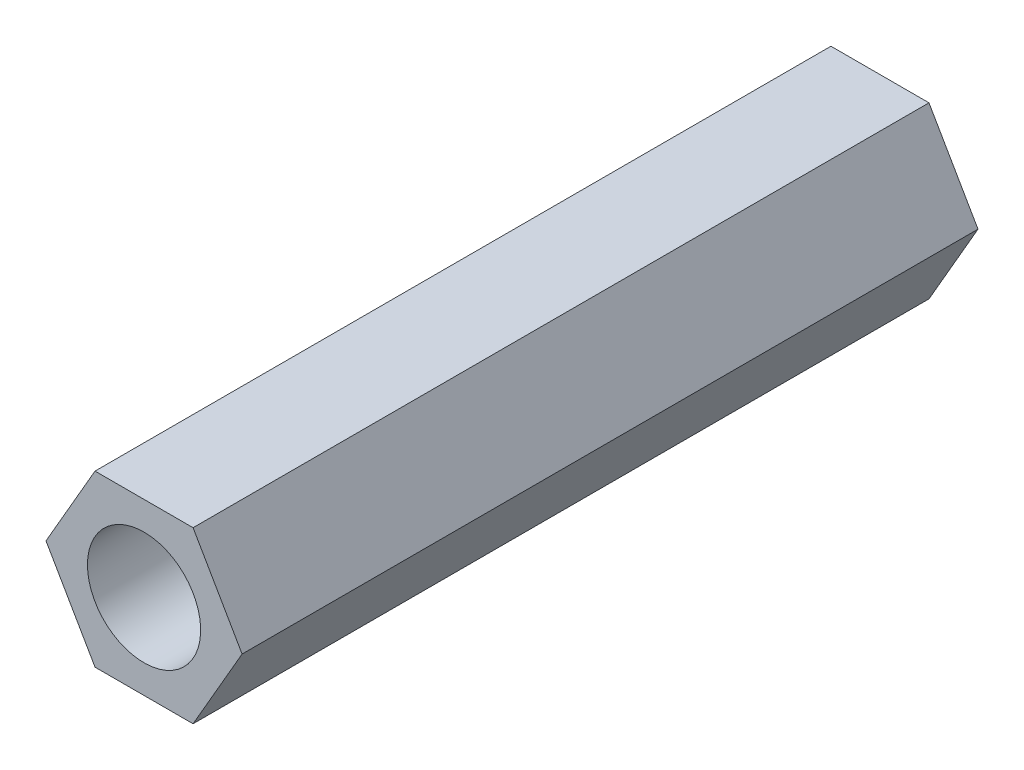
ISO-10303-21;
HEADER;
FILE_DESCRIPTION(('STEP AP214'),'2;1');
FILE_NAME('part.step','',(''),(''),'','','');
FILE_SCHEMA(('AUTOMOTIVE_DESIGN { 1 0 10303 214 1 1 1 1 }'));
ENDSEC;
DATA;
#1=APPLICATION_CONTEXT('core data for automotive mechanical design processes');
#2=APPLICATION_PROTOCOL_DEFINITION('international standard','automotive_design',2000,#1);
#3=PRODUCT_CONTEXT('',#1,'mechanical');
#4=PRODUCT('Part','Part','',(#3));
#5=PRODUCT_RELATED_PRODUCT_CATEGORY('part','',(#4));
#6=PRODUCT_DEFINITION_FORMATION('','',#4);
#7=PRODUCT_DEFINITION_CONTEXT('part definition',#1,'design');
#8=PRODUCT_DEFINITION('design','',#6,#7);
#9=PRODUCT_DEFINITION_SHAPE('','',#8);
#10=(LENGTH_UNIT() NAMED_UNIT(*) SI_UNIT(.MILLI.,.METRE.));
#11=(NAMED_UNIT(*) PLANE_ANGLE_UNIT() SI_UNIT($,.RADIAN.));
#12=(NAMED_UNIT(*) SI_UNIT($,.STERADIAN.) SOLID_ANGLE_UNIT());
#13=UNCERTAINTY_MEASURE_WITH_UNIT(LENGTH_MEASURE(1.E-05),#10,'distance_accuracy_value','');
#14=(GEOMETRIC_REPRESENTATION_CONTEXT(3) GLOBAL_UNCERTAINTY_ASSIGNED_CONTEXT((#13)) GLOBAL_UNIT_ASSIGNED_CONTEXT((#10,
#11,#12)) REPRESENTATION_CONTEXT('',''));
#15=CARTESIAN_POINT('',(0.,0.,0.));
#16=DIRECTION('',(0.,0.,1.));
#17=DIRECTION('',(1.,0.,0.));
#18=AXIS2_PLACEMENT_3D('',#15,#16,#17);
#19=CARTESIAN_POINT('',(0.,0.,13.));
#20=DIRECTION('',(0.,0.,1.));
#21=DIRECTION('',(1.,0.,0.));
#22=AXIS2_PLACEMENT_3D('',#19,#20,#21);
#23=PLANE('',#22);
#24=DIRECTION('',(0.5,0.866025403784438,0.));
#25=VECTOR('',#24,1.);
#26=CARTESIAN_POINT('',(0.86602540378444,-1.5,13.));
#27=LINE('',#26,#25);
#28=CARTESIAN_POINT('',(0.86602540378444,-1.5,13.));
#29=VERTEX_POINT('',#28);
#30=CARTESIAN_POINT('',(1.73205080756888,0.,13.));
#31=VERTEX_POINT('',#30);
#32=EDGE_CURVE('E145',#29,#31,#27,.T.);
#33=ORIENTED_EDGE('',*,*,#32,.T.);
#34=DIRECTION('',(-0.5,0.866025403784438,0.));
#35=VECTOR('',#34,1.);
#36=CARTESIAN_POINT('',(1.73205080756888,0.,13.));
#37=LINE('',#36,#35);
#38=CARTESIAN_POINT('',(0.866025403784438,1.5,13.));
#39=VERTEX_POINT('',#38);
#40=EDGE_CURVE('E93',#31,#39,#37,.T.);
#41=ORIENTED_EDGE('',*,*,#40,.T.);
#42=DIRECTION('',(-1.,0.,0.));
#43=VECTOR('',#42,1.);
#44=CARTESIAN_POINT('',(0.866025403784438,1.5,13.));
#45=LINE('',#44,#43);
#46=CARTESIAN_POINT('',(-0.866025403784439,1.5,13.));
#47=VERTEX_POINT('',#46);
#48=EDGE_CURVE('E106',#39,#47,#45,.T.);
#49=ORIENTED_EDGE('',*,*,#48,.T.);
#50=DIRECTION('',(-0.5,-0.866025403784438,0.));
#51=VECTOR('',#50,1.);
#52=CARTESIAN_POINT('',(-0.866025403784439,1.5,13.));
#53=LINE('',#52,#51);
#54=CARTESIAN_POINT('',(-1.73205080756888,0.,13.));
#55=VERTEX_POINT('',#54);
#56=EDGE_CURVE('E100',#47,#55,#53,.T.);
#57=ORIENTED_EDGE('',*,*,#56,.T.);
#58=DIRECTION('',(0.5,-0.866025403784438,0.));
#59=VECTOR('',#58,1.);
#60=CARTESIAN_POINT('',(-1.73205080756888,0.,13.));
#61=LINE('',#60,#59);
#62=CARTESIAN_POINT('',(-0.866025403784439,-1.5,13.));
#63=VERTEX_POINT('',#62);
#64=EDGE_CURVE('E104',#55,#63,#61,.T.);
#65=ORIENTED_EDGE('',*,*,#64,.T.);
#66=DIRECTION('',(1.,0.,0.));
#67=VECTOR('',#66,1.);
#68=CARTESIAN_POINT('',(-0.866025403784439,-1.5,13.));
#69=LINE('',#68,#67);
#70=EDGE_CURVE('E56',#63,#29,#69,.T.);
#71=ORIENTED_EDGE('',*,*,#70,.T.);
#72=EDGE_LOOP('',(#33,#41,#49,#57,#65,#71));
#73=FACE_BOUND('',#72,.T.);
#74=CARTESIAN_POINT('',(0.,0.,13.));
#75=DIRECTION('',(0.,0.,1.));
#76=DIRECTION('',(1.,0.,0.));
#77=AXIS2_PLACEMENT_3D('',#74,#75,#76);
#78=CIRCLE('',#77,1.);
#79=CARTESIAN_POINT('',(-1.,0.,13.));
#80=VERTEX_POINT('',#79);
#81=EDGE_CURVE('E133',#80,#80,#78,.T.);
#82=ORIENTED_EDGE('',*,*,#81,.F.);
#83=EDGE_LOOP('',(#82));
#84=FACE_BOUND('',#83,.T.);
#85=ADVANCED_FACE('F38',(#73,#84),#23,.T.);
#86=CARTESIAN_POINT('',(0.,0.,0.));
#87=DIRECTION('',(0.,0.,1.));
#88=DIRECTION('',(1.,0.,0.));
#89=AXIS2_PLACEMENT_3D('',#86,#87,#88);
#90=PLANE('',#89);
#91=DIRECTION('',(0.5,0.866025403784438,0.));
#92=VECTOR('',#91,1.);
#93=CARTESIAN_POINT('',(0.86602540378444,-1.5,0.));
#94=LINE('',#93,#92);
#95=CARTESIAN_POINT('',(0.86602540378444,-1.5,0.));
#96=VERTEX_POINT('',#95);
#97=CARTESIAN_POINT('',(1.73205080756888,0.,0.));
#98=VERTEX_POINT('',#97);
#99=EDGE_CURVE('E128',#96,#98,#94,.T.);
#100=ORIENTED_EDGE('',*,*,#99,.F.);
#101=DIRECTION('',(1.,0.,0.));
#102=VECTOR('',#101,1.);
#103=CARTESIAN_POINT('',(-0.866025403784439,-1.5,0.));
#104=LINE('',#103,#102);
#105=CARTESIAN_POINT('',(-0.866025403784439,-1.5,0.));
#106=VERTEX_POINT('',#105);
#107=EDGE_CURVE('E85',#106,#96,#104,.T.);
#108=ORIENTED_EDGE('',*,*,#107,.F.);
#109=DIRECTION('',(0.5,-0.866025403784438,0.));
#110=VECTOR('',#109,1.);
#111=CARTESIAN_POINT('',(-1.73205080756888,0.,0.));
#112=LINE('',#111,#110);
#113=CARTESIAN_POINT('',(-1.73205080756888,0.,0.));
#114=VERTEX_POINT('',#113);
#115=EDGE_CURVE('E79',#114,#106,#112,.T.);
#116=ORIENTED_EDGE('',*,*,#115,.F.);
#117=DIRECTION('',(-0.5,-0.866025403784438,0.));
#118=VECTOR('',#117,1.);
#119=CARTESIAN_POINT('',(-0.866025403784439,1.5,0.));
#120=LINE('',#119,#118);
#121=CARTESIAN_POINT('',(-0.866025403784439,1.5,0.));
#122=VERTEX_POINT('',#121);
#123=EDGE_CURVE('E115',#122,#114,#120,.T.);
#124=ORIENTED_EDGE('',*,*,#123,.F.);
#125=DIRECTION('',(-1.,0.,0.));
#126=VECTOR('',#125,1.);
#127=CARTESIAN_POINT('',(0.866025403784438,1.5,0.));
#128=LINE('',#127,#126);
#129=CARTESIAN_POINT('',(0.866025403784438,1.5,0.));
#130=VERTEX_POINT('',#129);
#131=EDGE_CURVE('E136',#130,#122,#128,.T.);
#132=ORIENTED_EDGE('',*,*,#131,.F.);
#133=DIRECTION('',(-0.5,0.866025403784438,0.));
#134=VECTOR('',#133,1.);
#135=CARTESIAN_POINT('',(1.73205080756888,0.,0.));
#136=LINE('',#135,#134);
#137=EDGE_CURVE('E132',#98,#130,#136,.T.);
#138=ORIENTED_EDGE('',*,*,#137,.F.);
#139=EDGE_LOOP('',(#100,#108,#116,#124,#132,#138));
#140=FACE_BOUND('',#139,.T.);
#141=CARTESIAN_POINT('',(0.,0.,0.));
#142=DIRECTION('',(0.,0.,1.));
#143=DIRECTION('',(1.,0.,0.));
#144=AXIS2_PLACEMENT_3D('',#141,#142,#143);
#145=CIRCLE('',#144,1.);
#146=CARTESIAN_POINT('',(-1.,0.,0.));
#147=VERTEX_POINT('',#146);
#148=EDGE_CURVE('E242',#147,#147,#145,.T.);
#149=ORIENTED_EDGE('',*,*,#148,.T.);
#150=EDGE_LOOP('',(#149));
#151=FACE_BOUND('',#150,.T.);
#152=ADVANCED_FACE('F158',(#140,#151),#90,.F.);
#153=CARTESIAN_POINT('',(0.86602540378444,-1.5,13.));
#154=DIRECTION('',(-0.866025403784438,0.5,0.));
#155=DIRECTION('',(-0.5,-0.866025403784439,0.));
#156=AXIS2_PLACEMENT_3D('',#153,#154,#155);
#157=PLANE('',#156);
#158=ORIENTED_EDGE('',*,*,#99,.T.);
#159=DIRECTION('',(0.,0.,-1.));
#160=VECTOR('',#159,1.);
#161=CARTESIAN_POINT('',(1.73205080756888,0.,13.));
#162=LINE('',#161,#160);
#163=EDGE_CURVE('E11',#31,#98,#162,.T.);
#164=ORIENTED_EDGE('',*,*,#163,.F.);
#165=ORIENTED_EDGE('',*,*,#32,.F.);
#166=DIRECTION('',(0.,0.,-1.));
#167=VECTOR('',#166,1.);
#168=CARTESIAN_POINT('',(0.86602540378444,-1.5,13.));
#169=LINE('',#168,#167);
#170=EDGE_CURVE('E124',#29,#96,#169,.T.);
#171=ORIENTED_EDGE('',*,*,#170,.T.);
#172=EDGE_LOOP('',(#158,#164,#165,#171));
#173=FACE_BOUND('',#172,.T.);
#174=ADVANCED_FACE('F40',(#173),#157,.F.);
#175=CARTESIAN_POINT('',(1.73205080756888,0.,13.));
#176=DIRECTION('',(-0.866025403784438,-0.5,0.));
#177=DIRECTION('',(0.5,-0.866025403784439,0.));
#178=AXIS2_PLACEMENT_3D('',#175,#176,#177);
#179=PLANE('',#178);
#180=ORIENTED_EDGE('',*,*,#137,.T.);
#181=DIRECTION('',(0.,0.,-1.));
#182=VECTOR('',#181,1.);
#183=CARTESIAN_POINT('',(0.866025403784438,1.5,13.));
#184=LINE('',#183,#182);
#185=EDGE_CURVE('E48',#39,#130,#184,.T.);
#186=ORIENTED_EDGE('',*,*,#185,.F.);
#187=ORIENTED_EDGE('',*,*,#40,.F.);
#188=ORIENTED_EDGE('',*,*,#163,.T.);
#189=EDGE_LOOP('',(#180,#186,#187,#188));
#190=FACE_BOUND('',#189,.T.);
#191=ADVANCED_FACE('F183',(#190),#179,.F.);
#192=CARTESIAN_POINT('',(0.866025403784438,1.5,13.));
#193=DIRECTION('',(0.,-1.,0.));
#194=DIRECTION('',(1.,0.,0.));
#195=AXIS2_PLACEMENT_3D('',#192,#193,#194);
#196=PLANE('',#195);
#197=ORIENTED_EDGE('',*,*,#131,.T.);
#198=DIRECTION('',(0.,0.,-1.));
#199=VECTOR('',#198,1.);
#200=CARTESIAN_POINT('',(-0.866025403784439,1.5,13.));
#201=LINE('',#200,#199);
#202=EDGE_CURVE('E117',#47,#122,#201,.T.);
#203=ORIENTED_EDGE('',*,*,#202,.F.);
#204=ORIENTED_EDGE('',*,*,#48,.F.);
#205=ORIENTED_EDGE('',*,*,#185,.T.);
#206=EDGE_LOOP('',(#197,#203,#204,#205));
#207=FACE_BOUND('',#206,.T.);
#208=ADVANCED_FACE('F155',(#207),#196,.F.);
#209=CARTESIAN_POINT('',(-0.866025403784439,1.5,13.));
#210=DIRECTION('',(0.866025403784438,-0.5,0.));
#211=DIRECTION('',(0.5,0.866025403784439,0.));
#212=AXIS2_PLACEMENT_3D('',#209,#210,#211);
#213=PLANE('',#212);
#214=ORIENTED_EDGE('',*,*,#123,.T.);
#215=DIRECTION('',(0.,0.,-1.));
#216=VECTOR('',#215,1.);
#217=CARTESIAN_POINT('',(-1.73205080756888,0.,13.));
#218=LINE('',#217,#216);
#219=EDGE_CURVE('E112',#55,#114,#218,.T.);
#220=ORIENTED_EDGE('',*,*,#219,.F.);
#221=ORIENTED_EDGE('',*,*,#56,.F.);
#222=ORIENTED_EDGE('',*,*,#202,.T.);
#223=EDGE_LOOP('',(#214,#220,#221,#222));
#224=FACE_BOUND('',#223,.T.);
#225=ADVANCED_FACE('F113',(#224),#213,.F.);
#226=CARTESIAN_POINT('',(-1.73205080756888,0.,13.));
#227=DIRECTION('',(0.866025403784438,0.5,0.));
#228=DIRECTION('',(-0.5,0.866025403784438,0.));
#229=AXIS2_PLACEMENT_3D('',#226,#227,#228);
#230=PLANE('',#229);
#231=ORIENTED_EDGE('',*,*,#115,.T.);
#232=DIRECTION('',(0.,0.,-1.));
#233=VECTOR('',#232,1.);
#234=CARTESIAN_POINT('',(-0.866025403784439,-1.5,13.));
#235=LINE('',#234,#233);
#236=EDGE_CURVE('E118',#63,#106,#235,.T.);
#237=ORIENTED_EDGE('',*,*,#236,.F.);
#238=ORIENTED_EDGE('',*,*,#64,.F.);
#239=ORIENTED_EDGE('',*,*,#219,.T.);
#240=EDGE_LOOP('',(#231,#237,#238,#239));
#241=FACE_BOUND('',#240,.T.);
#242=ADVANCED_FACE('F120',(#241),#230,.F.);
#243=CARTESIAN_POINT('',(-0.866025403784439,-1.5,13.));
#244=DIRECTION('',(0.,1.,0.));
#245=DIRECTION('',(-1.,0.,0.));
#246=AXIS2_PLACEMENT_3D('',#243,#244,#245);
#247=PLANE('',#246);
#248=ORIENTED_EDGE('',*,*,#107,.T.);
#249=ORIENTED_EDGE('',*,*,#170,.F.);
#250=ORIENTED_EDGE('',*,*,#70,.F.);
#251=ORIENTED_EDGE('',*,*,#236,.T.);
#252=EDGE_LOOP('',(#248,#249,#250,#251));
#253=FACE_BOUND('',#252,.T.);
#254=ADVANCED_FACE('F163',(#253),#247,.F.);
#255=CARTESIAN_POINT('',(0.,0.,13.));
#256=DIRECTION('',(0.,0.,-1.));
#257=DIRECTION('',(-1.,0.,0.));
#258=AXIS2_PLACEMENT_3D('',#255,#256,#257);
#259=CYLINDRICAL_SURFACE('',#258,1.);
#260=CARTESIAN_POINT('',(-1.,0.,13.));
#261=CARTESIAN_POINT('',(-1.,0.,12.8645833333333));
#262=CARTESIAN_POINT('',(-1.,0.,12.7291666666667));
#263=CARTESIAN_POINT('',(-1.,0.,12.4583333333333));
#264=CARTESIAN_POINT('',(-1.,0.,12.3229166666667));
#265=CARTESIAN_POINT('',(-1.,0.,12.0520833333333));
#266=CARTESIAN_POINT('',(-1.,0.,11.9166666666667));
#267=CARTESIAN_POINT('',(-1.,0.,11.6458333333333));
#268=CARTESIAN_POINT('',(-1.,0.,11.5104166666667));
#269=CARTESIAN_POINT('',(-1.,0.,11.2395833333333));
#270=CARTESIAN_POINT('',(-1.,0.,11.1041666666667));
#271=CARTESIAN_POINT('',(-1.,0.,10.8333333333333));
#272=CARTESIAN_POINT('',(-1.,0.,10.6979166666667));
#273=CARTESIAN_POINT('',(-1.,0.,10.4270833333333));
#274=CARTESIAN_POINT('',(-1.,0.,10.2916666666667));
#275=CARTESIAN_POINT('',(-1.,0.,10.0208333333333));
#276=CARTESIAN_POINT('',(-1.,0.,9.88541666666667));
#277=CARTESIAN_POINT('',(-1.,0.,9.61458333333333));
#278=CARTESIAN_POINT('',(-1.,0.,9.47916666666667));
#279=CARTESIAN_POINT('',(-1.,0.,9.20833333333333));
#280=CARTESIAN_POINT('',(-1.,0.,9.07291666666666));
#281=CARTESIAN_POINT('',(-1.,0.,8.80208333333333));
#282=CARTESIAN_POINT('',(-1.,0.,8.66666666666667));
#283=CARTESIAN_POINT('',(-1.,0.,8.39583333333333));
#284=CARTESIAN_POINT('',(-1.,0.,8.26041666666667));
#285=CARTESIAN_POINT('',(-1.,0.,7.98958333333333));
#286=CARTESIAN_POINT('',(-1.,0.,7.85416666666667));
#287=CARTESIAN_POINT('',(-1.,0.,7.58333333333333));
#288=CARTESIAN_POINT('',(-1.,0.,7.44791666666667));
#289=CARTESIAN_POINT('',(-1.,0.,7.17708333333333));
#290=CARTESIAN_POINT('',(-1.,0.,7.04166666666667));
#291=CARTESIAN_POINT('',(-1.,0.,6.77083333333333));
#292=CARTESIAN_POINT('',(-1.,0.,6.63541666666667));
#293=CARTESIAN_POINT('',(-1.,0.,6.36458333333333));
#294=CARTESIAN_POINT('',(-1.,0.,6.22916666666667));
#295=CARTESIAN_POINT('',(-1.,0.,5.95833333333333));
#296=CARTESIAN_POINT('',(-1.,0.,5.82291666666667));
#297=CARTESIAN_POINT('',(-1.,0.,5.55208333333333));
#298=CARTESIAN_POINT('',(-1.,0.,5.41666666666667));
#299=CARTESIAN_POINT('',(-1.,0.,5.14583333333333));
#300=CARTESIAN_POINT('',(-1.,0.,5.01041666666667));
#301=CARTESIAN_POINT('',(-1.,0.,4.73958333333333));
#302=CARTESIAN_POINT('',(-1.,0.,4.60416666666667));
#303=CARTESIAN_POINT('',(-1.,0.,4.33333333333333));
#304=CARTESIAN_POINT('',(-1.,0.,4.19791666666667));
#305=CARTESIAN_POINT('',(-1.,0.,3.92708333333333));
#306=CARTESIAN_POINT('',(-1.,0.,3.79166666666667));
#307=CARTESIAN_POINT('',(-1.,0.,3.52083333333333));
#308=CARTESIAN_POINT('',(-1.,0.,3.38541666666667));
#309=CARTESIAN_POINT('',(-1.,0.,3.11458333333333));
#310=CARTESIAN_POINT('',(-1.,0.,2.97916666666667));
#311=CARTESIAN_POINT('',(-1.,0.,2.70833333333333));
#312=CARTESIAN_POINT('',(-1.,0.,2.57291666666667));
#313=CARTESIAN_POINT('',(-1.,0.,2.30208333333333));
#314=CARTESIAN_POINT('',(-1.,0.,2.16666666666667));
#315=CARTESIAN_POINT('',(-1.,0.,1.89583333333333));
#316=CARTESIAN_POINT('',(-1.,0.,1.76041666666667));
#317=CARTESIAN_POINT('',(-1.,0.,1.48958333333333));
#318=CARTESIAN_POINT('',(-1.,0.,1.35416666666667));
#319=CARTESIAN_POINT('',(-1.,0.,1.08333333333333));
#320=CARTESIAN_POINT('',(-1.,0.,0.947916666666667));
#321=CARTESIAN_POINT('',(-1.,0.,0.677083333333334));
#322=CARTESIAN_POINT('',(-1.,0.,0.541666666666667));
#323=CARTESIAN_POINT('',(-1.,0.,0.270833333333334));
#324=CARTESIAN_POINT('',(-1.,0.,0.135416666666667));
#325=CARTESIAN_POINT('',(-1.,0.,0.));
#326=B_SPLINE_CURVE_WITH_KNOTS('',3,(#260,#261,#262,#263,#264,#265,#266,#267,#268,#269,#270,
#271,#272,#273,#274,#275,#276,#277,#278,#279,#280,#281,#282,#283,#284,#285,#286,#287,#288,#289,
#290,#291,#292,#293,#294,#295,#296,#297,#298,#299,#300,#301,#302,#303,#304,#305,#306,#307,#308,
#309,#310,#311,#312,#313,#314,#315,#316,#317,#318,#319,#320,#321,#322,#323,#324,#325),
.UNSPECIFIED.,.F.,.F.,(4,2,2,2,2,2,2,2,2,2,2,2,2,2,2,2,2,2,2,2,2,2,2,2,2,2,2,2,2,2,2,2,4),(0.,
0.40625,0.812500000000001,1.21875,1.625,2.03125,2.4375,2.84375,3.25,3.65625,4.0625,4.46875,
4.875,5.28125,5.6875,6.09375,6.5,6.90625,7.3125,7.71875,8.125,8.53125,8.9375,9.34375,9.75,
10.15625,10.5625,10.96875,11.375,11.78125,12.1875,12.59375,13.),.UNSPECIFIED.);
#327=EDGE_CURVE('BSEAM165',#80,#147,#326,.T.);
#328=ORIENTED_EDGE('',*,*,#81,.T.);
#329=ORIENTED_EDGE('',*,*,#148,.F.);
#330=ORIENTED_EDGE('',*,*,#327,.T.);
#331=ORIENTED_EDGE('',*,*,#327,.F.);
#332=EDGE_LOOP('',(#328,#330,#329,#331));
#333=FACE_BOUND('',#332,.T.);
#334=ADVANCED_FACE('F165',(#333),#259,.F.);
#335=CLOSED_SHELL('',(#85,#152,#174,#191,#208,#225,#242,#254,#334));
#336=MANIFOLD_SOLID_BREP('B2',#335);
#337=ADVANCED_BREP_SHAPE_REPRESENTATION('',(#18,#336),#14);
#338=SHAPE_DEFINITION_REPRESENTATION(#9,#337);
ENDSEC;
END-ISO-10303-21;
